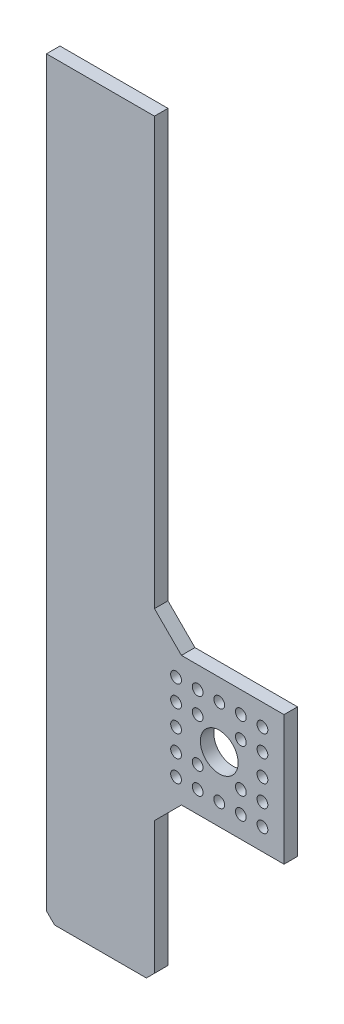
ISO-10303-21;
HEADER;
FILE_DESCRIPTION(('STEP AP214'),'2;1');
FILE_NAME('part.step','',(''),(''),'','','');
FILE_SCHEMA(('AUTOMOTIVE_DESIGN { 1 0 10303 214 1 1 1 1 }'));
ENDSEC;
DATA;
#1=APPLICATION_CONTEXT('core data for automotive mechanical design processes');
#2=APPLICATION_PROTOCOL_DEFINITION('international standard','automotive_design',2000,#1);
#3=PRODUCT_CONTEXT('',#1,'mechanical');
#4=PRODUCT('Part','Part','',(#3));
#5=PRODUCT_RELATED_PRODUCT_CATEGORY('part','',(#4));
#6=PRODUCT_DEFINITION_FORMATION('','',#4);
#7=PRODUCT_DEFINITION_CONTEXT('part definition',#1,'design');
#8=PRODUCT_DEFINITION('design','',#6,#7);
#9=PRODUCT_DEFINITION_SHAPE('','',#8);
#10=(LENGTH_UNIT() NAMED_UNIT(*) SI_UNIT(.MILLI.,.METRE.));
#11=(NAMED_UNIT(*) PLANE_ANGLE_UNIT() SI_UNIT($,.RADIAN.));
#12=(NAMED_UNIT(*) SI_UNIT($,.STERADIAN.) SOLID_ANGLE_UNIT());
#13=UNCERTAINTY_MEASURE_WITH_UNIT(LENGTH_MEASURE(1.E-05),#10,'distance_accuracy_value','');
#14=(GEOMETRIC_REPRESENTATION_CONTEXT(3) GLOBAL_UNCERTAINTY_ASSIGNED_CONTEXT((#13)) GLOBAL_UNIT_ASSIGNED_CONTEXT((#10,
#11,#12)) REPRESENTATION_CONTEXT('',''));
#15=CARTESIAN_POINT('',(0.,0.,0.));
#16=DIRECTION('',(0.,0.,1.));
#17=DIRECTION('',(1.,0.,0.));
#18=AXIS2_PLACEMENT_3D('',#15,#16,#17);
#19=CARTESIAN_POINT('',(0.,0.,5.));
#20=DIRECTION('',(0.,0.,1.));
#21=DIRECTION('',(1.,0.,0.));
#22=AXIS2_PLACEMENT_3D('',#19,#20,#21);
#23=PLANE('',#22);
#24=CARTESIAN_POINT('',(48.0000000000002,-200.,5.));
#25=DIRECTION('',(0.,0.,1.));
#26=DIRECTION('',(1.,0.,0.));
#27=AXIS2_PLACEMENT_3D('',#24,#25,#26);
#28=CIRCLE('',#27,2.);
#29=CARTESIAN_POINT('',(50.0000000000003,-200.,5.));
#30=VERTEX_POINT('',#29);
#31=EDGE_CURVE('E442',#30,#30,#28,.T.);
#32=ORIENTED_EDGE('',*,*,#31,.F.);
#33=EDGE_LOOP('',(#32));
#34=FACE_BOUND('',#33,.T.);
#35=CARTESIAN_POINT('',(48.0000000000001,-184.,5.));
#36=DIRECTION('',(0.,0.,1.));
#37=DIRECTION('',(1.,0.,0.));
#38=AXIS2_PLACEMENT_3D('',#35,#36,#37);
#39=CIRCLE('',#38,2.);
#40=CARTESIAN_POINT('',(50.0000000000001,-184.,5.));
#41=VERTEX_POINT('',#40);
#42=EDGE_CURVE('E426',#41,#41,#39,.T.);
#43=ORIENTED_EDGE('',*,*,#42,.F.);
#44=EDGE_LOOP('',(#43));
#45=FACE_BOUND('',#44,.T.);
#46=CARTESIAN_POINT('',(72.0000000000003,-208.,5.));
#47=DIRECTION('',(0.,0.,1.));
#48=DIRECTION('',(1.,0.,0.));
#49=AXIS2_PLACEMENT_3D('',#46,#47,#48);
#50=CIRCLE('',#49,2.00000000000001);
#51=CARTESIAN_POINT('',(74.0000000000003,-208.,5.));
#52=VERTEX_POINT('',#51);
#53=EDGE_CURVE('E410',#52,#52,#50,.T.);
#54=ORIENTED_EDGE('',*,*,#53,.F.);
#55=EDGE_LOOP('',(#54));
#56=FACE_BOUND('',#55,.T.);
#57=CARTESIAN_POINT('',(56.0000000000003,-208.,5.));
#58=DIRECTION('',(0.,0.,1.));
#59=DIRECTION('',(1.,0.,0.));
#60=AXIS2_PLACEMENT_3D('',#57,#58,#59);
#61=CIRCLE('',#60,2.);
#62=CARTESIAN_POINT('',(58.0000000000003,-208.,5.));
#63=VERTEX_POINT('',#62);
#64=EDGE_CURVE('E394',#63,#63,#61,.T.);
#65=ORIENTED_EDGE('',*,*,#64,.F.);
#66=EDGE_LOOP('',(#65));
#67=FACE_BOUND('',#66,.T.);
#68=CARTESIAN_POINT('',(72.0000000000002,-200.,5.));
#69=DIRECTION('',(0.,0.,1.));
#70=DIRECTION('',(1.,0.,0.));
#71=AXIS2_PLACEMENT_3D('',#68,#69,#70);
#72=CIRCLE('',#71,2.00000000000001);
#73=CARTESIAN_POINT('',(74.0000000000002,-200.,5.));
#74=VERTEX_POINT('',#73);
#75=EDGE_CURVE('E378',#74,#74,#72,.T.);
#76=ORIENTED_EDGE('',*,*,#75,.F.);
#77=EDGE_LOOP('',(#76));
#78=FACE_BOUND('',#77,.T.);
#79=CARTESIAN_POINT('',(80.0000000000001,-192.,5.));
#80=DIRECTION('',(0.,0.,1.));
#81=DIRECTION('',(1.,0.,0.));
#82=AXIS2_PLACEMENT_3D('',#79,#80,#81);
#83=CIRCLE('',#82,2.);
#84=CARTESIAN_POINT('',(82.0000000000001,-192.,5.));
#85=VERTEX_POINT('',#84);
#86=EDGE_CURVE('E362',#85,#85,#83,.T.);
#87=ORIENTED_EDGE('',*,*,#86,.F.);
#88=EDGE_LOOP('',(#87));
#89=FACE_BOUND('',#88,.T.);
#90=CARTESIAN_POINT('',(72.0000000000001,-184.,5.));
#91=DIRECTION('',(0.,0.,1.));
#92=DIRECTION('',(1.,0.,0.));
#93=AXIS2_PLACEMENT_3D('',#90,#91,#92);
#94=CIRCLE('',#93,2.00000000000001);
#95=CARTESIAN_POINT('',(74.0000000000001,-184.,5.));
#96=VERTEX_POINT('',#95);
#97=EDGE_CURVE('E346',#96,#96,#94,.T.);
#98=ORIENTED_EDGE('',*,*,#97,.F.);
#99=EDGE_LOOP('',(#98));
#100=FACE_BOUND('',#99,.T.);
#101=CARTESIAN_POINT('',(80.,-176.,5.));
#102=DIRECTION('',(0.,0.,1.));
#103=DIRECTION('',(1.,0.,0.));
#104=AXIS2_PLACEMENT_3D('',#101,#102,#103);
#105=CIRCLE('',#104,2.);
#106=CARTESIAN_POINT('',(82.,-176.,5.));
#107=VERTEX_POINT('',#106);
#108=EDGE_CURVE('E330',#107,#107,#105,.T.);
#109=ORIENTED_EDGE('',*,*,#108,.F.);
#110=EDGE_LOOP('',(#109));
#111=FACE_BOUND('',#110,.T.);
#112=CARTESIAN_POINT('',(64.,-176.,5.));
#113=DIRECTION('',(0.,0.,1.));
#114=DIRECTION('',(1.,0.,0.));
#115=AXIS2_PLACEMENT_3D('',#112,#113,#114);
#116=CIRCLE('',#115,2.00000000000001);
#117=CARTESIAN_POINT('',(66.,-176.,5.));
#118=VERTEX_POINT('',#117);
#119=EDGE_CURVE('E314',#118,#118,#116,.T.);
#120=ORIENTED_EDGE('',*,*,#119,.F.);
#121=EDGE_LOOP('',(#120));
#122=FACE_BOUND('',#121,.T.);
#123=CARTESIAN_POINT('',(48.,-176.,5.));
#124=DIRECTION('',(0.,0.,1.));
#125=DIRECTION('',(1.,0.,0.));
#126=AXIS2_PLACEMENT_3D('',#123,#124,#125);
#127=CIRCLE('',#126,2.);
#128=CARTESIAN_POINT('',(50.,-176.,5.));
#129=VERTEX_POINT('',#128);
#130=EDGE_CURVE('E298',#129,#129,#127,.T.);
#131=ORIENTED_EDGE('',*,*,#130,.F.);
#132=EDGE_LOOP('',(#131));
#133=FACE_BOUND('',#132,.T.);
#134=DIRECTION('',(0.,-1.,0.));
#135=VECTOR('',#134,1.);
#136=CARTESIAN_POINT('',(0.,0.,5.));
#137=LINE('',#136,#135);
#138=CARTESIAN_POINT('',(0.,0.,5.));
#139=VERTEX_POINT('',#138);
#140=CARTESIAN_POINT('',(0.,-275.,5.));
#141=VERTEX_POINT('',#140);
#142=EDGE_CURVE('E132',#139,#141,#137,.T.);
#143=ORIENTED_EDGE('',*,*,#142,.T.);
#144=DIRECTION('',(-0.707106781186541,0.707106781186554,0.));
#145=VECTOR('',#144,1.);
#146=CARTESIAN_POINT('',(-137.5,-137.499999999997,5.));
#147=LINE('',#146,#145);
#148=CARTESIAN_POINT('',(3.00000000000004,-278.,5.));
#149=VERTEX_POINT('',#148);
#150=EDGE_CURVE('E187',#141,#149,#147,.F.);
#151=ORIENTED_EDGE('',*,*,#150,.T.);
#152=DIRECTION('',(1.,0.,0.));
#153=VECTOR('',#152,1.);
#154=CARTESIAN_POINT('',(0.,-278.,5.));
#155=LINE('',#154,#153);
#156=CARTESIAN_POINT('',(37.,-278.,5.));
#157=VERTEX_POINT('',#156);
#158=EDGE_CURVE('E144',#149,#157,#155,.T.);
#159=ORIENTED_EDGE('',*,*,#158,.T.);
#160=DIRECTION('',(-0.707106781186548,-0.707106781186548,0.));
#161=VECTOR('',#160,1.);
#162=CARTESIAN_POINT('',(157.5,-157.5,5.));
#163=LINE('',#162,#161);
#164=CARTESIAN_POINT('',(40.,-275.,5.));
#165=VERTEX_POINT('',#164);
#166=EDGE_CURVE('E184',#157,#165,#163,.F.);
#167=ORIENTED_EDGE('',*,*,#166,.T.);
#168=DIRECTION('',(0.,1.,0.));
#169=VECTOR('',#168,1.);
#170=CARTESIAN_POINT('',(40.,-278.,5.));
#171=LINE('',#170,#169);
#172=CARTESIAN_POINT('',(40.,-226.,5.));
#173=VERTEX_POINT('',#172);
#174=EDGE_CURVE('E219',#165,#173,#171,.T.);
#175=ORIENTED_EDGE('',*,*,#174,.T.);
#176=DIRECTION('',(-0.70710678118655,-0.707106781186545,0.));
#177=VECTOR('',#176,1.);
#178=CARTESIAN_POINT('',(50.,-216.,5.));
#179=LINE('',#178,#177);
#180=CARTESIAN_POINT('',(50.,-216.,5.));
#181=VERTEX_POINT('',#180);
#182=EDGE_CURVE('E210',#173,#181,#179,.F.);
#183=ORIENTED_EDGE('',*,*,#182,.T.);
#184=DIRECTION('',(1.,0.,0.));
#185=VECTOR('',#184,1.);
#186=CARTESIAN_POINT('',(40.,-216.,5.));
#187=LINE('',#186,#185);
#188=CARTESIAN_POINT('',(88.,-216.,5.));
#189=VERTEX_POINT('',#188);
#190=EDGE_CURVE('E216',#181,#189,#187,.T.);
#191=ORIENTED_EDGE('',*,*,#190,.T.);
#192=DIRECTION('',(0.,1.,0.));
#193=VECTOR('',#192,1.);
#194=CARTESIAN_POINT('',(88.,-216.,5.));
#195=LINE('',#194,#193);
#196=CARTESIAN_POINT('',(88.,-168.,5.));
#197=VERTEX_POINT('',#196);
#198=EDGE_CURVE('E228',#189,#197,#195,.T.);
#199=ORIENTED_EDGE('',*,*,#198,.T.);
#200=DIRECTION('',(-1.,0.,0.));
#201=VECTOR('',#200,1.);
#202=CARTESIAN_POINT('',(88.,-168.,5.));
#203=LINE('',#202,#201);
#204=CARTESIAN_POINT('',(50.,-168.,5.));
#205=VERTEX_POINT('',#204);
#206=EDGE_CURVE('E267',#197,#205,#203,.T.);
#207=ORIENTED_EDGE('',*,*,#206,.T.);
#208=DIRECTION('',(0.707106781186545,-0.70710678118655,0.));
#209=VECTOR('',#208,1.);
#210=CARTESIAN_POINT('',(40.,-158.,5.));
#211=LINE('',#210,#209);
#212=CARTESIAN_POINT('',(40.,-158.,5.));
#213=VERTEX_POINT('',#212);
#214=EDGE_CURVE('E11',#205,#213,#211,.F.);
#215=ORIENTED_EDGE('',*,*,#214,.T.);
#216=DIRECTION('',(0.,1.,0.));
#217=VECTOR('',#216,1.);
#218=CARTESIAN_POINT('',(40.,-168.,5.));
#219=LINE('',#218,#217);
#220=CARTESIAN_POINT('',(40.,0.,5.));
#221=VERTEX_POINT('',#220);
#222=EDGE_CURVE('E150',#213,#221,#219,.T.);
#223=ORIENTED_EDGE('',*,*,#222,.T.);
#224=DIRECTION('',(-1.,0.,0.));
#225=VECTOR('',#224,1.);
#226=CARTESIAN_POINT('',(40.,0.,5.));
#227=LINE('',#226,#225);
#228=EDGE_CURVE('E145',#221,#139,#227,.T.);
#229=ORIENTED_EDGE('',*,*,#228,.T.);
#230=EDGE_LOOP('',(#143,#151,#159,#167,#175,#183,#191,#199,#207,#215,#223,#229));
#231=FACE_BOUND('',#230,.T.);
#232=CARTESIAN_POINT('',(64.,-192.,5.));
#233=DIRECTION('',(0.,0.,1.));
#234=DIRECTION('',(1.,0.,0.));
#235=AXIS2_PLACEMENT_3D('',#232,#233,#234);
#236=CIRCLE('',#235,7.);
#237=CARTESIAN_POINT('',(71.,-192.,5.));
#238=VERTEX_POINT('',#237);
#239=EDGE_CURVE('E279',#238,#238,#236,.T.);
#240=ORIENTED_EDGE('',*,*,#239,.F.);
#241=EDGE_LOOP('',(#240));
#242=FACE_BOUND('',#241,.T.);
#243=CARTESIAN_POINT('',(56.,-176.,5.));
#244=DIRECTION('',(0.,0.,1.));
#245=DIRECTION('',(1.,0.,0.));
#246=AXIS2_PLACEMENT_3D('',#243,#244,#245);
#247=CIRCLE('',#246,2.);
#248=CARTESIAN_POINT('',(58.,-176.,5.));
#249=VERTEX_POINT('',#248);
#250=EDGE_CURVE('E306',#249,#249,#247,.T.);
#251=ORIENTED_EDGE('',*,*,#250,.F.);
#252=EDGE_LOOP('',(#251));
#253=FACE_BOUND('',#252,.T.);
#254=CARTESIAN_POINT('',(72.,-176.,5.));
#255=DIRECTION('',(0.,0.,1.));
#256=DIRECTION('',(1.,0.,0.));
#257=AXIS2_PLACEMENT_3D('',#254,#255,#256);
#258=CIRCLE('',#257,2.00000000000001);
#259=CARTESIAN_POINT('',(74.,-176.,5.));
#260=VERTEX_POINT('',#259);
#261=EDGE_CURVE('E322',#260,#260,#258,.T.);
#262=ORIENTED_EDGE('',*,*,#261,.F.);
#263=EDGE_LOOP('',(#262));
#264=FACE_BOUND('',#263,.T.);
#265=CARTESIAN_POINT('',(56.0000000000001,-184.,5.));
#266=DIRECTION('',(0.,0.,1.));
#267=DIRECTION('',(1.,0.,0.));
#268=AXIS2_PLACEMENT_3D('',#265,#266,#267);
#269=CIRCLE('',#268,2.);
#270=CARTESIAN_POINT('',(58.0000000000001,-184.,5.));
#271=VERTEX_POINT('',#270);
#272=EDGE_CURVE('E338',#271,#271,#269,.T.);
#273=ORIENTED_EDGE('',*,*,#272,.F.);
#274=EDGE_LOOP('',(#273));
#275=FACE_BOUND('',#274,.T.);
#276=CARTESIAN_POINT('',(80.0000000000001,-184.,5.));
#277=DIRECTION('',(0.,0.,1.));
#278=DIRECTION('',(1.,0.,0.));
#279=AXIS2_PLACEMENT_3D('',#276,#277,#278);
#280=CIRCLE('',#279,2.);
#281=CARTESIAN_POINT('',(82.0000000000001,-184.,5.));
#282=VERTEX_POINT('',#281);
#283=EDGE_CURVE('E354',#282,#282,#280,.T.);
#284=ORIENTED_EDGE('',*,*,#283,.F.);
#285=EDGE_LOOP('',(#284));
#286=FACE_BOUND('',#285,.T.);
#287=CARTESIAN_POINT('',(56.0000000000002,-200.,5.));
#288=DIRECTION('',(0.,0.,1.));
#289=DIRECTION('',(1.,0.,0.));
#290=AXIS2_PLACEMENT_3D('',#287,#288,#289);
#291=CIRCLE('',#290,2.);
#292=CARTESIAN_POINT('',(58.0000000000002,-200.,5.));
#293=VERTEX_POINT('',#292);
#294=EDGE_CURVE('E370',#293,#293,#291,.T.);
#295=ORIENTED_EDGE('',*,*,#294,.F.);
#296=EDGE_LOOP('',(#295));
#297=FACE_BOUND('',#296,.T.);
#298=CARTESIAN_POINT('',(80.0000000000002,-200.,5.));
#299=DIRECTION('',(0.,0.,1.));
#300=DIRECTION('',(1.,0.,0.));
#301=AXIS2_PLACEMENT_3D('',#298,#299,#300);
#302=CIRCLE('',#301,2.);
#303=CARTESIAN_POINT('',(82.0000000000002,-200.,5.));
#304=VERTEX_POINT('',#303);
#305=EDGE_CURVE('E386',#304,#304,#302,.T.);
#306=ORIENTED_EDGE('',*,*,#305,.F.);
#307=EDGE_LOOP('',(#306));
#308=FACE_BOUND('',#307,.T.);
#309=CARTESIAN_POINT('',(64.0000000000003,-208.,5.));
#310=DIRECTION('',(0.,0.,1.));
#311=DIRECTION('',(1.,0.,0.));
#312=AXIS2_PLACEMENT_3D('',#309,#310,#311);
#313=CIRCLE('',#312,2.00000000000001);
#314=CARTESIAN_POINT('',(66.0000000000003,-208.,5.));
#315=VERTEX_POINT('',#314);
#316=EDGE_CURVE('E402',#315,#315,#313,.T.);
#317=ORIENTED_EDGE('',*,*,#316,.F.);
#318=EDGE_LOOP('',(#317));
#319=FACE_BOUND('',#318,.T.);
#320=CARTESIAN_POINT('',(80.0000000000003,-208.,5.));
#321=DIRECTION('',(0.,0.,1.));
#322=DIRECTION('',(1.,0.,0.));
#323=AXIS2_PLACEMENT_3D('',#320,#321,#322);
#324=CIRCLE('',#323,2.);
#325=CARTESIAN_POINT('',(82.0000000000003,-208.,5.));
#326=VERTEX_POINT('',#325);
#327=EDGE_CURVE('E418',#326,#326,#324,.T.);
#328=ORIENTED_EDGE('',*,*,#327,.F.);
#329=EDGE_LOOP('',(#328));
#330=FACE_BOUND('',#329,.T.);
#331=CARTESIAN_POINT('',(48.0000000000002,-192.,5.));
#332=DIRECTION('',(0.,0.,1.));
#333=DIRECTION('',(1.,0.,0.));
#334=AXIS2_PLACEMENT_3D('',#331,#332,#333);
#335=CIRCLE('',#334,2.);
#336=CARTESIAN_POINT('',(50.0000000000002,-192.,5.));
#337=VERTEX_POINT('',#336);
#338=EDGE_CURVE('E434',#337,#337,#335,.T.);
#339=ORIENTED_EDGE('',*,*,#338,.F.);
#340=EDGE_LOOP('',(#339));
#341=FACE_BOUND('',#340,.T.);
#342=CARTESIAN_POINT('',(48.0000000000003,-208.,5.));
#343=DIRECTION('',(0.,0.,1.));
#344=DIRECTION('',(1.,0.,0.));
#345=AXIS2_PLACEMENT_3D('',#342,#343,#344);
#346=CIRCLE('',#345,2.);
#347=CARTESIAN_POINT('',(50.0000000000003,-208.,5.));
#348=VERTEX_POINT('',#347);
#349=EDGE_CURVE('E450',#348,#348,#346,.T.);
#350=ORIENTED_EDGE('',*,*,#349,.F.);
#351=EDGE_LOOP('',(#350));
#352=FACE_BOUND('',#351,.T.);
#353=ADVANCED_FACE('F41',(#34,#45,#56,#67,#78,#89,#100,#111,#122,#133,#231,#242,#253,#264,#275,
#286,#297,#308,#319,#330,#341,#352),#23,.T.);
#354=CARTESIAN_POINT('',(0.,0.,0.));
#355=DIRECTION('',(0.,0.,1.));
#356=DIRECTION('',(1.,0.,0.));
#357=AXIS2_PLACEMENT_3D('',#354,#355,#356);
#358=PLANE('',#357);
#359=DIRECTION('',(1.,0.,0.));
#360=VECTOR('',#359,1.);
#361=CARTESIAN_POINT('',(0.,-278.,0.));
#362=LINE('',#361,#360);
#363=CARTESIAN_POINT('',(3.00000000000004,-278.,0.));
#364=VERTEX_POINT('',#363);
#365=CARTESIAN_POINT('',(37.,-278.,0.));
#366=VERTEX_POINT('',#365);
#367=EDGE_CURVE('E243',#364,#366,#362,.T.);
#368=ORIENTED_EDGE('',*,*,#367,.F.);
#369=DIRECTION('',(0.707106781186541,-0.707106781186554,0.));
#370=VECTOR('',#369,1.);
#371=CARTESIAN_POINT('',(3.00000000000004,-278.,0.));
#372=LINE('',#371,#370);
#373=CARTESIAN_POINT('',(0.,-275.,0.));
#374=VERTEX_POINT('',#373);
#375=EDGE_CURVE('E179',#364,#374,#372,.F.);
#376=ORIENTED_EDGE('',*,*,#375,.T.);
#377=DIRECTION('',(0.,-1.,0.));
#378=VECTOR('',#377,1.);
#379=CARTESIAN_POINT('',(0.,0.,0.));
#380=LINE('',#379,#378);
#381=CARTESIAN_POINT('',(0.,0.,0.));
#382=VERTEX_POINT('',#381);
#383=EDGE_CURVE('E250',#382,#374,#380,.T.);
#384=ORIENTED_EDGE('',*,*,#383,.F.);
#385=DIRECTION('',(-1.,0.,0.));
#386=VECTOR('',#385,1.);
#387=CARTESIAN_POINT('',(40.,0.,0.));
#388=LINE('',#387,#386);
#389=CARTESIAN_POINT('',(40.,0.,0.));
#390=VERTEX_POINT('',#389);
#391=EDGE_CURVE('E159',#390,#382,#388,.T.);
#392=ORIENTED_EDGE('',*,*,#391,.F.);
#393=DIRECTION('',(0.,1.,0.));
#394=VECTOR('',#393,1.);
#395=CARTESIAN_POINT('',(40.,-168.,0.));
#396=LINE('',#395,#394);
#397=CARTESIAN_POINT('',(40.,-158.,0.));
#398=VERTEX_POINT('',#397);
#399=EDGE_CURVE('E155',#398,#390,#396,.T.);
#400=ORIENTED_EDGE('',*,*,#399,.F.);
#401=DIRECTION('',(-0.707106781186545,0.70710678118655,0.));
#402=VECTOR('',#401,1.);
#403=CARTESIAN_POINT('',(-58.9999999999998,-58.9999999999993,0.));
#404=LINE('',#403,#402);
#405=CARTESIAN_POINT('',(50.,-168.,0.));
#406=VERTEX_POINT('',#405);
#407=EDGE_CURVE('E51',#398,#406,#404,.F.);
#408=ORIENTED_EDGE('',*,*,#407,.T.);
#409=DIRECTION('',(-1.,0.,0.));
#410=VECTOR('',#409,1.);
#411=CARTESIAN_POINT('',(88.,-168.,0.));
#412=LINE('',#411,#410);
#413=CARTESIAN_POINT('',(88.,-168.,0.));
#414=VERTEX_POINT('',#413);
#415=EDGE_CURVE('E256',#414,#406,#412,.T.);
#416=ORIENTED_EDGE('',*,*,#415,.F.);
#417=DIRECTION('',(0.,1.,0.));
#418=VECTOR('',#417,1.);
#419=CARTESIAN_POINT('',(88.,-216.,0.));
#420=LINE('',#419,#418);
#421=CARTESIAN_POINT('',(88.,-216.,0.));
#422=VERTEX_POINT('',#421);
#423=EDGE_CURVE('E247',#422,#414,#420,.T.);
#424=ORIENTED_EDGE('',*,*,#423,.F.);
#425=DIRECTION('',(1.,0.,0.));
#426=VECTOR('',#425,1.);
#427=CARTESIAN_POINT('',(40.,-216.,0.));
#428=LINE('',#427,#426);
#429=CARTESIAN_POINT('',(50.,-216.,0.));
#430=VERTEX_POINT('',#429);
#431=EDGE_CURVE('E238',#430,#422,#428,.T.);
#432=ORIENTED_EDGE('',*,*,#431,.F.);
#433=DIRECTION('',(0.70710678118655,0.707106781186545,0.));
#434=VECTOR('',#433,1.);
#435=CARTESIAN_POINT('',(133.,-133.000000000001,0.));
#436=LINE('',#435,#434);
#437=CARTESIAN_POINT('',(40.,-226.,0.));
#438=VERTEX_POINT('',#437);
#439=EDGE_CURVE('E207',#430,#438,#436,.F.);
#440=ORIENTED_EDGE('',*,*,#439,.T.);
#441=DIRECTION('',(0.,1.,0.));
#442=VECTOR('',#441,1.);
#443=CARTESIAN_POINT('',(40.,-278.,0.));
#444=LINE('',#443,#442);
#445=CARTESIAN_POINT('',(40.,-275.,0.));
#446=VERTEX_POINT('',#445);
#447=EDGE_CURVE('E236',#446,#438,#444,.T.);
#448=ORIENTED_EDGE('',*,*,#447,.F.);
#449=DIRECTION('',(0.707106781186548,0.707106781186548,0.));
#450=VECTOR('',#449,1.);
#451=CARTESIAN_POINT('',(40.,-275.,0.));
#452=LINE('',#451,#450);
#453=EDGE_CURVE('E176',#446,#366,#452,.F.);
#454=ORIENTED_EDGE('',*,*,#453,.T.);
#455=EDGE_LOOP('',(#368,#376,#384,#392,#400,#408,#416,#424,#432,#440,#448,#454));
#456=FACE_BOUND('',#455,.T.);
#457=CARTESIAN_POINT('',(64.,-192.,0.));
#458=DIRECTION('',(0.,0.,1.));
#459=DIRECTION('',(1.,0.,0.));
#460=AXIS2_PLACEMENT_3D('',#457,#458,#459);
#461=CIRCLE('',#460,7.);
#462=CARTESIAN_POINT('',(71.,-192.,0.));
#463=VERTEX_POINT('',#462);
#464=EDGE_CURVE('E294',#463,#463,#461,.T.);
#465=ORIENTED_EDGE('',*,*,#464,.T.);
#466=EDGE_LOOP('',(#465));
#467=FACE_BOUND('',#466,.T.);
#468=CARTESIAN_POINT('',(48.,-176.,0.));
#469=DIRECTION('',(0.,0.,1.));
#470=DIRECTION('',(1.,0.,0.));
#471=AXIS2_PLACEMENT_3D('',#468,#469,#470);
#472=CIRCLE('',#471,2.);
#473=CARTESIAN_POINT('',(50.,-176.,0.));
#474=VERTEX_POINT('',#473);
#475=EDGE_CURVE('E302',#474,#474,#472,.T.);
#476=ORIENTED_EDGE('',*,*,#475,.T.);
#477=EDGE_LOOP('',(#476));
#478=FACE_BOUND('',#477,.T.);
#479=CARTESIAN_POINT('',(56.,-176.,0.));
#480=DIRECTION('',(0.,0.,1.));
#481=DIRECTION('',(1.,0.,0.));
#482=AXIS2_PLACEMENT_3D('',#479,#480,#481);
#483=CIRCLE('',#482,2.);
#484=CARTESIAN_POINT('',(58.,-176.,0.));
#485=VERTEX_POINT('',#484);
#486=EDGE_CURVE('E310',#485,#485,#483,.T.);
#487=ORIENTED_EDGE('',*,*,#486,.T.);
#488=EDGE_LOOP('',(#487));
#489=FACE_BOUND('',#488,.T.);
#490=CARTESIAN_POINT('',(64.,-176.,0.));
#491=DIRECTION('',(0.,0.,1.));
#492=DIRECTION('',(1.,0.,0.));
#493=AXIS2_PLACEMENT_3D('',#490,#491,#492);
#494=CIRCLE('',#493,2.00000000000001);
#495=CARTESIAN_POINT('',(66.,-176.,0.));
#496=VERTEX_POINT('',#495);
#497=EDGE_CURVE('E318',#496,#496,#494,.T.);
#498=ORIENTED_EDGE('',*,*,#497,.T.);
#499=EDGE_LOOP('',(#498));
#500=FACE_BOUND('',#499,.T.);
#501=CARTESIAN_POINT('',(72.,-176.,0.));
#502=DIRECTION('',(0.,0.,1.));
#503=DIRECTION('',(1.,0.,0.));
#504=AXIS2_PLACEMENT_3D('',#501,#502,#503);
#505=CIRCLE('',#504,2.00000000000001);
#506=CARTESIAN_POINT('',(74.,-176.,0.));
#507=VERTEX_POINT('',#506);
#508=EDGE_CURVE('E326',#507,#507,#505,.T.);
#509=ORIENTED_EDGE('',*,*,#508,.T.);
#510=EDGE_LOOP('',(#509));
#511=FACE_BOUND('',#510,.T.);
#512=CARTESIAN_POINT('',(80.,-176.,0.));
#513=DIRECTION('',(0.,0.,1.));
#514=DIRECTION('',(1.,0.,0.));
#515=AXIS2_PLACEMENT_3D('',#512,#513,#514);
#516=CIRCLE('',#515,2.);
#517=CARTESIAN_POINT('',(82.,-176.,0.));
#518=VERTEX_POINT('',#517);
#519=EDGE_CURVE('E334',#518,#518,#516,.T.);
#520=ORIENTED_EDGE('',*,*,#519,.T.);
#521=EDGE_LOOP('',(#520));
#522=FACE_BOUND('',#521,.T.);
#523=CARTESIAN_POINT('',(56.0000000000001,-184.,0.));
#524=DIRECTION('',(0.,0.,1.));
#525=DIRECTION('',(1.,0.,0.));
#526=AXIS2_PLACEMENT_3D('',#523,#524,#525);
#527=CIRCLE('',#526,2.);
#528=CARTESIAN_POINT('',(58.0000000000001,-184.,0.));
#529=VERTEX_POINT('',#528);
#530=EDGE_CURVE('E342',#529,#529,#527,.T.);
#531=ORIENTED_EDGE('',*,*,#530,.T.);
#532=EDGE_LOOP('',(#531));
#533=FACE_BOUND('',#532,.T.);
#534=CARTESIAN_POINT('',(72.0000000000001,-184.,0.));
#535=DIRECTION('',(0.,0.,1.));
#536=DIRECTION('',(1.,0.,0.));
#537=AXIS2_PLACEMENT_3D('',#534,#535,#536);
#538=CIRCLE('',#537,2.00000000000001);
#539=CARTESIAN_POINT('',(74.0000000000001,-184.,0.));
#540=VERTEX_POINT('',#539);
#541=EDGE_CURVE('E350',#540,#540,#538,.T.);
#542=ORIENTED_EDGE('',*,*,#541,.T.);
#543=EDGE_LOOP('',(#542));
#544=FACE_BOUND('',#543,.T.);
#545=CARTESIAN_POINT('',(80.0000000000001,-184.,0.));
#546=DIRECTION('',(0.,0.,1.));
#547=DIRECTION('',(1.,0.,0.));
#548=AXIS2_PLACEMENT_3D('',#545,#546,#547);
#549=CIRCLE('',#548,2.);
#550=CARTESIAN_POINT('',(82.0000000000001,-184.,0.));
#551=VERTEX_POINT('',#550);
#552=EDGE_CURVE('E358',#551,#551,#549,.T.);
#553=ORIENTED_EDGE('',*,*,#552,.T.);
#554=EDGE_LOOP('',(#553));
#555=FACE_BOUND('',#554,.T.);
#556=CARTESIAN_POINT('',(80.0000000000001,-192.,0.));
#557=DIRECTION('',(0.,0.,1.));
#558=DIRECTION('',(1.,0.,0.));
#559=AXIS2_PLACEMENT_3D('',#556,#557,#558);
#560=CIRCLE('',#559,2.);
#561=CARTESIAN_POINT('',(82.0000000000001,-192.,0.));
#562=VERTEX_POINT('',#561);
#563=EDGE_CURVE('E366',#562,#562,#560,.T.);
#564=ORIENTED_EDGE('',*,*,#563,.T.);
#565=EDGE_LOOP('',(#564));
#566=FACE_BOUND('',#565,.T.);
#567=CARTESIAN_POINT('',(56.0000000000002,-200.,0.));
#568=DIRECTION('',(0.,0.,1.));
#569=DIRECTION('',(1.,0.,0.));
#570=AXIS2_PLACEMENT_3D('',#567,#568,#569);
#571=CIRCLE('',#570,2.);
#572=CARTESIAN_POINT('',(58.0000000000002,-200.,0.));
#573=VERTEX_POINT('',#572);
#574=EDGE_CURVE('E374',#573,#573,#571,.T.);
#575=ORIENTED_EDGE('',*,*,#574,.T.);
#576=EDGE_LOOP('',(#575));
#577=FACE_BOUND('',#576,.T.);
#578=CARTESIAN_POINT('',(72.0000000000002,-200.,0.));
#579=DIRECTION('',(0.,0.,1.));
#580=DIRECTION('',(1.,0.,0.));
#581=AXIS2_PLACEMENT_3D('',#578,#579,#580);
#582=CIRCLE('',#581,2.00000000000001);
#583=CARTESIAN_POINT('',(74.0000000000002,-200.,0.));
#584=VERTEX_POINT('',#583);
#585=EDGE_CURVE('E382',#584,#584,#582,.T.);
#586=ORIENTED_EDGE('',*,*,#585,.T.);
#587=EDGE_LOOP('',(#586));
#588=FACE_BOUND('',#587,.T.);
#589=CARTESIAN_POINT('',(80.0000000000002,-200.,0.));
#590=DIRECTION('',(0.,0.,1.));
#591=DIRECTION('',(1.,0.,0.));
#592=AXIS2_PLACEMENT_3D('',#589,#590,#591);
#593=CIRCLE('',#592,2.);
#594=CARTESIAN_POINT('',(82.0000000000002,-200.,0.));
#595=VERTEX_POINT('',#594);
#596=EDGE_CURVE('E390',#595,#595,#593,.T.);
#597=ORIENTED_EDGE('',*,*,#596,.T.);
#598=EDGE_LOOP('',(#597));
#599=FACE_BOUND('',#598,.T.);
#600=CARTESIAN_POINT('',(56.0000000000003,-208.,0.));
#601=DIRECTION('',(0.,0.,1.));
#602=DIRECTION('',(1.,0.,0.));
#603=AXIS2_PLACEMENT_3D('',#600,#601,#602);
#604=CIRCLE('',#603,2.);
#605=CARTESIAN_POINT('',(58.0000000000003,-208.,0.));
#606=VERTEX_POINT('',#605);
#607=EDGE_CURVE('E398',#606,#606,#604,.T.);
#608=ORIENTED_EDGE('',*,*,#607,.T.);
#609=EDGE_LOOP('',(#608));
#610=FACE_BOUND('',#609,.T.);
#611=CARTESIAN_POINT('',(64.0000000000003,-208.,0.));
#612=DIRECTION('',(0.,0.,1.));
#613=DIRECTION('',(1.,0.,0.));
#614=AXIS2_PLACEMENT_3D('',#611,#612,#613);
#615=CIRCLE('',#614,2.00000000000001);
#616=CARTESIAN_POINT('',(66.0000000000003,-208.,0.));
#617=VERTEX_POINT('',#616);
#618=EDGE_CURVE('E406',#617,#617,#615,.T.);
#619=ORIENTED_EDGE('',*,*,#618,.T.);
#620=EDGE_LOOP('',(#619));
#621=FACE_BOUND('',#620,.T.);
#622=CARTESIAN_POINT('',(72.0000000000003,-208.,0.));
#623=DIRECTION('',(0.,0.,1.));
#624=DIRECTION('',(1.,0.,0.));
#625=AXIS2_PLACEMENT_3D('',#622,#623,#624);
#626=CIRCLE('',#625,2.00000000000001);
#627=CARTESIAN_POINT('',(74.0000000000003,-208.,0.));
#628=VERTEX_POINT('',#627);
#629=EDGE_CURVE('E414',#628,#628,#626,.T.);
#630=ORIENTED_EDGE('',*,*,#629,.T.);
#631=EDGE_LOOP('',(#630));
#632=FACE_BOUND('',#631,.T.);
#633=CARTESIAN_POINT('',(80.0000000000003,-208.,0.));
#634=DIRECTION('',(0.,0.,1.));
#635=DIRECTION('',(1.,0.,0.));
#636=AXIS2_PLACEMENT_3D('',#633,#634,#635);
#637=CIRCLE('',#636,2.);
#638=CARTESIAN_POINT('',(82.0000000000003,-208.,0.));
#639=VERTEX_POINT('',#638);
#640=EDGE_CURVE('E422',#639,#639,#637,.T.);
#641=ORIENTED_EDGE('',*,*,#640,.T.);
#642=EDGE_LOOP('',(#641));
#643=FACE_BOUND('',#642,.T.);
#644=CARTESIAN_POINT('',(48.0000000000001,-184.,0.));
#645=DIRECTION('',(0.,0.,1.));
#646=DIRECTION('',(1.,0.,0.));
#647=AXIS2_PLACEMENT_3D('',#644,#645,#646);
#648=CIRCLE('',#647,2.);
#649=CARTESIAN_POINT('',(50.0000000000001,-184.,0.));
#650=VERTEX_POINT('',#649);
#651=EDGE_CURVE('E430',#650,#650,#648,.T.);
#652=ORIENTED_EDGE('',*,*,#651,.T.);
#653=EDGE_LOOP('',(#652));
#654=FACE_BOUND('',#653,.T.);
#655=CARTESIAN_POINT('',(48.0000000000002,-192.,0.));
#656=DIRECTION('',(0.,0.,1.));
#657=DIRECTION('',(1.,0.,0.));
#658=AXIS2_PLACEMENT_3D('',#655,#656,#657);
#659=CIRCLE('',#658,2.);
#660=CARTESIAN_POINT('',(50.0000000000002,-192.,0.));
#661=VERTEX_POINT('',#660);
#662=EDGE_CURVE('E438',#661,#661,#659,.T.);
#663=ORIENTED_EDGE('',*,*,#662,.T.);
#664=EDGE_LOOP('',(#663));
#665=FACE_BOUND('',#664,.T.);
#666=CARTESIAN_POINT('',(48.0000000000002,-200.,0.));
#667=DIRECTION('',(0.,0.,1.));
#668=DIRECTION('',(1.,0.,0.));
#669=AXIS2_PLACEMENT_3D('',#666,#667,#668);
#670=CIRCLE('',#669,2.);
#671=CARTESIAN_POINT('',(50.0000000000003,-200.,0.));
#672=VERTEX_POINT('',#671);
#673=EDGE_CURVE('E446',#672,#672,#670,.T.);
#674=ORIENTED_EDGE('',*,*,#673,.T.);
#675=EDGE_LOOP('',(#674));
#676=FACE_BOUND('',#675,.T.);
#677=CARTESIAN_POINT('',(48.0000000000003,-208.,0.));
#678=DIRECTION('',(0.,0.,1.));
#679=DIRECTION('',(1.,0.,0.));
#680=AXIS2_PLACEMENT_3D('',#677,#678,#679);
#681=CIRCLE('',#680,2.);
#682=CARTESIAN_POINT('',(50.0000000000003,-208.,0.));
#683=VERTEX_POINT('',#682);
#684=EDGE_CURVE('E454',#683,#683,#681,.T.);
#685=ORIENTED_EDGE('',*,*,#684,.T.);
#686=EDGE_LOOP('',(#685));
#687=FACE_BOUND('',#686,.T.);
#688=ADVANCED_FACE('F234',(#456,#467,#478,#489,#500,#511,#522,#533,#544,#555,#566,#577,#588,
#599,#610,#621,#632,#643,#654,#665,#676,#687),#358,.F.);
#689=CARTESIAN_POINT('',(40.,0.,5.));
#690=DIRECTION('',(0.,-1.,0.));
#691=DIRECTION('',(1.,0.,0.));
#692=AXIS2_PLACEMENT_3D('',#689,#690,#691);
#693=PLANE('',#692);
#694=ORIENTED_EDGE('',*,*,#391,.T.);
#695=DIRECTION('',(0.,0.,-1.));
#696=VECTOR('',#695,1.);
#697=CARTESIAN_POINT('',(0.,0.,5.));
#698=LINE('',#697,#696);
#699=EDGE_CURVE('E137',#139,#382,#698,.T.);
#700=ORIENTED_EDGE('',*,*,#699,.F.);
#701=ORIENTED_EDGE('',*,*,#228,.F.);
#702=DIRECTION('',(0.,0.,-1.));
#703=VECTOR('',#702,1.);
#704=CARTESIAN_POINT('',(40.,0.,5.));
#705=LINE('',#704,#703);
#706=EDGE_CURVE('E261',#221,#390,#705,.T.);
#707=ORIENTED_EDGE('',*,*,#706,.T.);
#708=EDGE_LOOP('',(#694,#700,#701,#707));
#709=FACE_BOUND('',#708,.T.);
#710=ADVANCED_FACE('F157',(#709),#693,.F.);
#711=CARTESIAN_POINT('',(0.,0.,5.));
#712=DIRECTION('',(1.,0.,0.));
#713=DIRECTION('',(0.,1.,0.));
#714=AXIS2_PLACEMENT_3D('',#711,#712,#713);
#715=PLANE('',#714);
#716=ORIENTED_EDGE('',*,*,#383,.T.);
#717=DIRECTION('',(0.,0.,1.));
#718=VECTOR('',#717,1.);
#719=CARTESIAN_POINT('',(0.,-275.,5.));
#720=LINE('',#719,#718);
#721=EDGE_CURVE('E140',#374,#141,#720,.T.);
#722=ORIENTED_EDGE('',*,*,#721,.T.);
#723=ORIENTED_EDGE('',*,*,#142,.F.);
#724=ORIENTED_EDGE('',*,*,#699,.T.);
#725=EDGE_LOOP('',(#716,#722,#723,#724));
#726=FACE_BOUND('',#725,.T.);
#727=ADVANCED_FACE('F135',(#726),#715,.F.);
#728=CARTESIAN_POINT('',(0.,-278.,5.));
#729=DIRECTION('',(0.,1.,0.));
#730=DIRECTION('',(0.,0.,1.));
#731=AXIS2_PLACEMENT_3D('',#728,#729,#730);
#732=PLANE('',#731);
#733=ORIENTED_EDGE('',*,*,#158,.F.);
#734=DIRECTION('',(0.,0.,-1.));
#735=VECTOR('',#734,1.);
#736=CARTESIAN_POINT('',(3.00000000000004,-278.,5.));
#737=LINE('',#736,#735);
#738=EDGE_CURVE('E166',#149,#364,#737,.T.);
#739=ORIENTED_EDGE('',*,*,#738,.T.);
#740=ORIENTED_EDGE('',*,*,#367,.T.);
#741=DIRECTION('',(0.,0.,1.));
#742=VECTOR('',#741,1.);
#743=CARTESIAN_POINT('',(37.,-278.,5.));
#744=LINE('',#743,#742);
#745=EDGE_CURVE('E161',#366,#157,#744,.T.);
#746=ORIENTED_EDGE('',*,*,#745,.T.);
#747=EDGE_LOOP('',(#733,#739,#740,#746));
#748=FACE_BOUND('',#747,.T.);
#749=ADVANCED_FACE('F288',(#748),#732,.F.);
#750=CARTESIAN_POINT('',(40.,-278.,5.));
#751=DIRECTION('',(-1.,0.,0.));
#752=DIRECTION('',(0.,0.,1.));
#753=AXIS2_PLACEMENT_3D('',#750,#751,#752);
#754=PLANE('',#753);
#755=ORIENTED_EDGE('',*,*,#447,.T.);
#756=DIRECTION('',(0.,0.,1.));
#757=VECTOR('',#756,1.);
#758=CARTESIAN_POINT('',(40.,-226.,5.));
#759=LINE('',#758,#757);
#760=EDGE_CURVE('E198',#438,#173,#759,.T.);
#761=ORIENTED_EDGE('',*,*,#760,.T.);
#762=ORIENTED_EDGE('',*,*,#174,.F.);
#763=DIRECTION('',(0.,0.,-1.));
#764=VECTOR('',#763,1.);
#765=CARTESIAN_POINT('',(40.,-275.,5.));
#766=LINE('',#765,#764);
#767=EDGE_CURVE('E190',#165,#446,#766,.T.);
#768=ORIENTED_EDGE('',*,*,#767,.T.);
#769=EDGE_LOOP('',(#755,#761,#762,#768));
#770=FACE_BOUND('',#769,.T.);
#771=ADVANCED_FACE('F240',(#770),#754,.F.);
#772=CARTESIAN_POINT('',(40.,-216.,5.));
#773=DIRECTION('',(0.,1.,0.));
#774=DIRECTION('',(-1.,0.,0.));
#775=AXIS2_PLACEMENT_3D('',#772,#773,#774);
#776=PLANE('',#775);
#777=ORIENTED_EDGE('',*,*,#190,.F.);
#778=DIRECTION('',(0.,0.,-1.));
#779=VECTOR('',#778,1.);
#780=CARTESIAN_POINT('',(50.,-216.,0.));
#781=LINE('',#780,#779);
#782=EDGE_CURVE('E194',#181,#430,#781,.T.);
#783=ORIENTED_EDGE('',*,*,#782,.T.);
#784=ORIENTED_EDGE('',*,*,#431,.T.);
#785=DIRECTION('',(0.,0.,-1.));
#786=VECTOR('',#785,1.);
#787=CARTESIAN_POINT('',(88.,-216.,5.));
#788=LINE('',#787,#786);
#789=EDGE_CURVE('E162',#189,#422,#788,.T.);
#790=ORIENTED_EDGE('',*,*,#789,.F.);
#791=EDGE_LOOP('',(#777,#783,#784,#790));
#792=FACE_BOUND('',#791,.T.);
#793=ADVANCED_FACE('F224',(#792),#776,.F.);
#794=CARTESIAN_POINT('',(88.,-216.,5.));
#795=DIRECTION('',(-1.,0.,0.));
#796=DIRECTION('',(0.,-1.,0.));
#797=AXIS2_PLACEMENT_3D('',#794,#795,#796);
#798=PLANE('',#797);
#799=ORIENTED_EDGE('',*,*,#423,.T.);
#800=DIRECTION('',(0.,0.,-1.));
#801=VECTOR('',#800,1.);
#802=CARTESIAN_POINT('',(88.,-168.,5.));
#803=LINE('',#802,#801);
#804=EDGE_CURVE('E169',#197,#414,#803,.T.);
#805=ORIENTED_EDGE('',*,*,#804,.F.);
#806=ORIENTED_EDGE('',*,*,#198,.F.);
#807=ORIENTED_EDGE('',*,*,#789,.T.);
#808=EDGE_LOOP('',(#799,#805,#806,#807));
#809=FACE_BOUND('',#808,.T.);
#810=ADVANCED_FACE('F269',(#809),#798,.F.);
#811=CARTESIAN_POINT('',(88.,-168.,5.));
#812=DIRECTION('',(0.,-1.,0.));
#813=DIRECTION('',(0.,0.,-1.));
#814=AXIS2_PLACEMENT_3D('',#811,#812,#813);
#815=PLANE('',#814);
#816=ORIENTED_EDGE('',*,*,#415,.T.);
#817=DIRECTION('',(0.,0.,1.));
#818=VECTOR('',#817,1.);
#819=CARTESIAN_POINT('',(50.,-168.,5.));
#820=LINE('',#819,#818);
#821=EDGE_CURVE('E58',#406,#205,#820,.T.);
#822=ORIENTED_EDGE('',*,*,#821,.T.);
#823=ORIENTED_EDGE('',*,*,#206,.F.);
#824=ORIENTED_EDGE('',*,*,#804,.T.);
#825=EDGE_LOOP('',(#816,#822,#823,#824));
#826=FACE_BOUND('',#825,.T.);
#827=ADVANCED_FACE('F266',(#826),#815,.F.);
#828=CARTESIAN_POINT('',(40.,-168.,5.));
#829=DIRECTION('',(-1.,0.,0.));
#830=DIRECTION('',(0.,0.,1.));
#831=AXIS2_PLACEMENT_3D('',#828,#829,#830);
#832=PLANE('',#831);
#833=ORIENTED_EDGE('',*,*,#222,.F.);
#834=DIRECTION('',(0.,0.,-1.));
#835=VECTOR('',#834,1.);
#836=CARTESIAN_POINT('',(40.,-158.,0.));
#837=LINE('',#836,#835);
#838=EDGE_CURVE('E201',#213,#398,#837,.T.);
#839=ORIENTED_EDGE('',*,*,#838,.T.);
#840=ORIENTED_EDGE('',*,*,#399,.T.);
#841=ORIENTED_EDGE('',*,*,#706,.F.);
#842=EDGE_LOOP('',(#833,#839,#840,#841));
#843=FACE_BOUND('',#842,.T.);
#844=ADVANCED_FACE('F478',(#843),#832,.F.);
#845=CARTESIAN_POINT('',(64.,-192.,5.));
#846=DIRECTION('',(0.,0.,-1.));
#847=DIRECTION('',(-1.,0.,0.));
#848=AXIS2_PLACEMENT_3D('',#845,#846,#847);
#849=CYLINDRICAL_SURFACE('',#848,7.);
#850=ORIENTED_EDGE('',*,*,#239,.T.);
#851=EDGE_LOOP('',(#850));
#852=FACE_BOUND('',#851,.T.);
#853=ORIENTED_EDGE('',*,*,#464,.F.);
#854=EDGE_LOOP('',(#853));
#855=FACE_BOUND('',#854,.T.);
#856=ADVANCED_FACE('F475',(#852,#855),#849,.F.);
#857=CARTESIAN_POINT('',(48.,-176.,5.));
#858=DIRECTION('',(0.,0.,-1.));
#859=DIRECTION('',(-1.,0.,0.));
#860=AXIS2_PLACEMENT_3D('',#857,#858,#859);
#861=CYLINDRICAL_SURFACE('',#860,2.);
#862=ORIENTED_EDGE('',*,*,#130,.T.);
#863=EDGE_LOOP('',(#862));
#864=FACE_BOUND('',#863,.T.);
#865=ORIENTED_EDGE('',*,*,#475,.F.);
#866=EDGE_LOOP('',(#865));
#867=FACE_BOUND('',#866,.T.);
#868=ADVANCED_FACE('F773',(#864,#867),#861,.F.);
#869=CARTESIAN_POINT('',(56.,-176.,5.));
#870=DIRECTION('',(0.,0.,-1.));
#871=DIRECTION('',(-1.,0.,0.));
#872=AXIS2_PLACEMENT_3D('',#869,#870,#871);
#873=CYLINDRICAL_SURFACE('',#872,2.);
#874=ORIENTED_EDGE('',*,*,#250,.T.);
#875=EDGE_LOOP('',(#874));
#876=FACE_BOUND('',#875,.T.);
#877=ORIENTED_EDGE('',*,*,#486,.F.);
#878=EDGE_LOOP('',(#877));
#879=FACE_BOUND('',#878,.T.);
#880=ADVANCED_FACE('F763',(#876,#879),#873,.F.);
#881=CARTESIAN_POINT('',(64.,-176.,5.));
#882=DIRECTION('',(0.,0.,-1.));
#883=DIRECTION('',(-1.,0.,0.));
#884=AXIS2_PLACEMENT_3D('',#881,#882,#883);
#885=CYLINDRICAL_SURFACE('',#884,2.00000000000001);
#886=ORIENTED_EDGE('',*,*,#119,.T.);
#887=EDGE_LOOP('',(#886));
#888=FACE_BOUND('',#887,.T.);
#889=ORIENTED_EDGE('',*,*,#497,.F.);
#890=EDGE_LOOP('',(#889));
#891=FACE_BOUND('',#890,.T.);
#892=ADVANCED_FACE('F753',(#888,#891),#885,.F.);
#893=CARTESIAN_POINT('',(72.,-176.,5.));
#894=DIRECTION('',(0.,0.,-1.));
#895=DIRECTION('',(-1.,0.,0.));
#896=AXIS2_PLACEMENT_3D('',#893,#894,#895);
#897=CYLINDRICAL_SURFACE('',#896,2.00000000000001);
#898=ORIENTED_EDGE('',*,*,#261,.T.);
#899=EDGE_LOOP('',(#898));
#900=FACE_BOUND('',#899,.T.);
#901=ORIENTED_EDGE('',*,*,#508,.F.);
#902=EDGE_LOOP('',(#901));
#903=FACE_BOUND('',#902,.T.);
#904=ADVANCED_FACE('F743',(#900,#903),#897,.F.);
#905=CARTESIAN_POINT('',(80.,-176.,5.));
#906=DIRECTION('',(0.,0.,-1.));
#907=DIRECTION('',(-1.,0.,0.));
#908=AXIS2_PLACEMENT_3D('',#905,#906,#907);
#909=CYLINDRICAL_SURFACE('',#908,2.);
#910=ORIENTED_EDGE('',*,*,#108,.T.);
#911=EDGE_LOOP('',(#910));
#912=FACE_BOUND('',#911,.T.);
#913=ORIENTED_EDGE('',*,*,#519,.F.);
#914=EDGE_LOOP('',(#913));
#915=FACE_BOUND('',#914,.T.);
#916=ADVANCED_FACE('F733',(#912,#915),#909,.F.);
#917=CARTESIAN_POINT('',(56.0000000000001,-184.,5.));
#918=DIRECTION('',(0.,0.,-1.));
#919=DIRECTION('',(-1.,0.,0.));
#920=AXIS2_PLACEMENT_3D('',#917,#918,#919);
#921=CYLINDRICAL_SURFACE('',#920,2.);
#922=ORIENTED_EDGE('',*,*,#272,.T.);
#923=EDGE_LOOP('',(#922));
#924=FACE_BOUND('',#923,.T.);
#925=ORIENTED_EDGE('',*,*,#530,.F.);
#926=EDGE_LOOP('',(#925));
#927=FACE_BOUND('',#926,.T.);
#928=ADVANCED_FACE('F723',(#924,#927),#921,.F.);
#929=CARTESIAN_POINT('',(72.0000000000001,-184.,5.));
#930=DIRECTION('',(0.,0.,-1.));
#931=DIRECTION('',(-1.,0.,0.));
#932=AXIS2_PLACEMENT_3D('',#929,#930,#931);
#933=CYLINDRICAL_SURFACE('',#932,2.00000000000001);
#934=ORIENTED_EDGE('',*,*,#97,.T.);
#935=EDGE_LOOP('',(#934));
#936=FACE_BOUND('',#935,.T.);
#937=ORIENTED_EDGE('',*,*,#541,.F.);
#938=EDGE_LOOP('',(#937));
#939=FACE_BOUND('',#938,.T.);
#940=ADVANCED_FACE('F713',(#936,#939),#933,.F.);
#941=CARTESIAN_POINT('',(80.0000000000001,-184.,5.));
#942=DIRECTION('',(0.,0.,-1.));
#943=DIRECTION('',(-1.,0.,0.));
#944=AXIS2_PLACEMENT_3D('',#941,#942,#943);
#945=CYLINDRICAL_SURFACE('',#944,2.);
#946=ORIENTED_EDGE('',*,*,#283,.T.);
#947=EDGE_LOOP('',(#946));
#948=FACE_BOUND('',#947,.T.);
#949=ORIENTED_EDGE('',*,*,#552,.F.);
#950=EDGE_LOOP('',(#949));
#951=FACE_BOUND('',#950,.T.);
#952=ADVANCED_FACE('F703',(#948,#951),#945,.F.);
#953=CARTESIAN_POINT('',(80.0000000000001,-192.,5.));
#954=DIRECTION('',(0.,0.,-1.));
#955=DIRECTION('',(-1.,0.,0.));
#956=AXIS2_PLACEMENT_3D('',#953,#954,#955);
#957=CYLINDRICAL_SURFACE('',#956,2.);
#958=ORIENTED_EDGE('',*,*,#86,.T.);
#959=EDGE_LOOP('',(#958));
#960=FACE_BOUND('',#959,.T.);
#961=ORIENTED_EDGE('',*,*,#563,.F.);
#962=EDGE_LOOP('',(#961));
#963=FACE_BOUND('',#962,.T.);
#964=ADVANCED_FACE('F693',(#960,#963),#957,.F.);
#965=CARTESIAN_POINT('',(56.0000000000002,-200.,5.));
#966=DIRECTION('',(0.,0.,-1.));
#967=DIRECTION('',(-1.,0.,0.));
#968=AXIS2_PLACEMENT_3D('',#965,#966,#967);
#969=CYLINDRICAL_SURFACE('',#968,2.);
#970=ORIENTED_EDGE('',*,*,#294,.T.);
#971=EDGE_LOOP('',(#970));
#972=FACE_BOUND('',#971,.T.);
#973=ORIENTED_EDGE('',*,*,#574,.F.);
#974=EDGE_LOOP('',(#973));
#975=FACE_BOUND('',#974,.T.);
#976=ADVANCED_FACE('F683',(#972,#975),#969,.F.);
#977=CARTESIAN_POINT('',(72.0000000000002,-200.,5.));
#978=DIRECTION('',(0.,0.,-1.));
#979=DIRECTION('',(-1.,0.,0.));
#980=AXIS2_PLACEMENT_3D('',#977,#978,#979);
#981=CYLINDRICAL_SURFACE('',#980,2.00000000000001);
#982=ORIENTED_EDGE('',*,*,#75,.T.);
#983=EDGE_LOOP('',(#982));
#984=FACE_BOUND('',#983,.T.);
#985=ORIENTED_EDGE('',*,*,#585,.F.);
#986=EDGE_LOOP('',(#985));
#987=FACE_BOUND('',#986,.T.);
#988=ADVANCED_FACE('F673',(#984,#987),#981,.F.);
#989=CARTESIAN_POINT('',(80.0000000000002,-200.,5.));
#990=DIRECTION('',(0.,0.,-1.));
#991=DIRECTION('',(-1.,0.,0.));
#992=AXIS2_PLACEMENT_3D('',#989,#990,#991);
#993=CYLINDRICAL_SURFACE('',#992,2.);
#994=ORIENTED_EDGE('',*,*,#305,.T.);
#995=EDGE_LOOP('',(#994));
#996=FACE_BOUND('',#995,.T.);
#997=ORIENTED_EDGE('',*,*,#596,.F.);
#998=EDGE_LOOP('',(#997));
#999=FACE_BOUND('',#998,.T.);
#1000=ADVANCED_FACE('F663',(#996,#999),#993,.F.);
#1001=CARTESIAN_POINT('',(56.0000000000003,-208.,5.));
#1002=DIRECTION('',(0.,0.,-1.));
#1003=DIRECTION('',(-1.,0.,0.));
#1004=AXIS2_PLACEMENT_3D('',#1001,#1002,#1003);
#1005=CYLINDRICAL_SURFACE('',#1004,2.);
#1006=ORIENTED_EDGE('',*,*,#64,.T.);
#1007=EDGE_LOOP('',(#1006));
#1008=FACE_BOUND('',#1007,.T.);
#1009=ORIENTED_EDGE('',*,*,#607,.F.);
#1010=EDGE_LOOP('',(#1009));
#1011=FACE_BOUND('',#1010,.T.);
#1012=ADVANCED_FACE('F653',(#1008,#1011),#1005,.F.);
#1013=CARTESIAN_POINT('',(64.0000000000003,-208.,5.));
#1014=DIRECTION('',(0.,0.,-1.));
#1015=DIRECTION('',(-1.,0.,0.));
#1016=AXIS2_PLACEMENT_3D('',#1013,#1014,#1015);
#1017=CYLINDRICAL_SURFACE('',#1016,2.00000000000001);
#1018=ORIENTED_EDGE('',*,*,#316,.T.);
#1019=EDGE_LOOP('',(#1018));
#1020=FACE_BOUND('',#1019,.T.);
#1021=ORIENTED_EDGE('',*,*,#618,.F.);
#1022=EDGE_LOOP('',(#1021));
#1023=FACE_BOUND('',#1022,.T.);
#1024=ADVANCED_FACE('F643',(#1020,#1023),#1017,.F.);
#1025=CARTESIAN_POINT('',(72.0000000000003,-208.,5.));
#1026=DIRECTION('',(0.,0.,-1.));
#1027=DIRECTION('',(-1.,0.,0.));
#1028=AXIS2_PLACEMENT_3D('',#1025,#1026,#1027);
#1029=CYLINDRICAL_SURFACE('',#1028,2.00000000000001);
#1030=ORIENTED_EDGE('',*,*,#53,.T.);
#1031=EDGE_LOOP('',(#1030));
#1032=FACE_BOUND('',#1031,.T.);
#1033=ORIENTED_EDGE('',*,*,#629,.F.);
#1034=EDGE_LOOP('',(#1033));
#1035=FACE_BOUND('',#1034,.T.);
#1036=ADVANCED_FACE('F633',(#1032,#1035),#1029,.F.);
#1037=CARTESIAN_POINT('',(80.0000000000003,-208.,5.));
#1038=DIRECTION('',(0.,0.,-1.));
#1039=DIRECTION('',(-1.,0.,0.));
#1040=AXIS2_PLACEMENT_3D('',#1037,#1038,#1039);
#1041=CYLINDRICAL_SURFACE('',#1040,2.);
#1042=ORIENTED_EDGE('',*,*,#327,.T.);
#1043=EDGE_LOOP('',(#1042));
#1044=FACE_BOUND('',#1043,.T.);
#1045=ORIENTED_EDGE('',*,*,#640,.F.);
#1046=EDGE_LOOP('',(#1045));
#1047=FACE_BOUND('',#1046,.T.);
#1048=ADVANCED_FACE('F623',(#1044,#1047),#1041,.F.);
#1049=CARTESIAN_POINT('',(48.0000000000001,-184.,5.));
#1050=DIRECTION('',(0.,0.,-1.));
#1051=DIRECTION('',(-1.,0.,0.));
#1052=AXIS2_PLACEMENT_3D('',#1049,#1050,#1051);
#1053=CYLINDRICAL_SURFACE('',#1052,2.);
#1054=ORIENTED_EDGE('',*,*,#42,.T.);
#1055=EDGE_LOOP('',(#1054));
#1056=FACE_BOUND('',#1055,.T.);
#1057=ORIENTED_EDGE('',*,*,#651,.F.);
#1058=EDGE_LOOP('',(#1057));
#1059=FACE_BOUND('',#1058,.T.);
#1060=ADVANCED_FACE('F613',(#1056,#1059),#1053,.F.);
#1061=CARTESIAN_POINT('',(48.0000000000002,-192.,5.));
#1062=DIRECTION('',(0.,0.,-1.));
#1063=DIRECTION('',(-1.,0.,0.));
#1064=AXIS2_PLACEMENT_3D('',#1061,#1062,#1063);
#1065=CYLINDRICAL_SURFACE('',#1064,2.);
#1066=ORIENTED_EDGE('',*,*,#338,.T.);
#1067=EDGE_LOOP('',(#1066));
#1068=FACE_BOUND('',#1067,.T.);
#1069=ORIENTED_EDGE('',*,*,#662,.F.);
#1070=EDGE_LOOP('',(#1069));
#1071=FACE_BOUND('',#1070,.T.);
#1072=ADVANCED_FACE('F603',(#1068,#1071),#1065,.F.);
#1073=CARTESIAN_POINT('',(48.0000000000002,-200.,5.));
#1074=DIRECTION('',(0.,0.,-1.));
#1075=DIRECTION('',(-1.,0.,0.));
#1076=AXIS2_PLACEMENT_3D('',#1073,#1074,#1075);
#1077=CYLINDRICAL_SURFACE('',#1076,2.);
#1078=ORIENTED_EDGE('',*,*,#31,.T.);
#1079=EDGE_LOOP('',(#1078));
#1080=FACE_BOUND('',#1079,.T.);
#1081=ORIENTED_EDGE('',*,*,#673,.F.);
#1082=EDGE_LOOP('',(#1081));
#1083=FACE_BOUND('',#1082,.T.);
#1084=ADVANCED_FACE('F594',(#1080,#1083),#1077,.F.);
#1085=CARTESIAN_POINT('',(48.0000000000003,-208.,5.));
#1086=DIRECTION('',(0.,0.,-1.));
#1087=DIRECTION('',(-1.,0.,0.));
#1088=AXIS2_PLACEMENT_3D('',#1085,#1086,#1087);
#1089=CYLINDRICAL_SURFACE('',#1088,2.);
#1090=ORIENTED_EDGE('',*,*,#349,.T.);
#1091=EDGE_LOOP('',(#1090));
#1092=FACE_BOUND('',#1091,.T.);
#1093=ORIENTED_EDGE('',*,*,#684,.F.);
#1094=EDGE_LOOP('',(#1093));
#1095=FACE_BOUND('',#1094,.T.);
#1096=ADVANCED_FACE('F462',(#1092,#1095),#1089,.F.);
#1097=CARTESIAN_POINT('',(3.00000000000004,-278.,5.));
#1098=DIRECTION('',(0.707106781186554,0.707106781186541,0.));
#1099=DIRECTION('',(0.,0.,-1.));
#1100=AXIS2_PLACEMENT_3D('',#1097,#1098,#1099);
#1101=PLANE('',#1100);
#1102=ORIENTED_EDGE('',*,*,#150,.F.);
#1103=ORIENTED_EDGE('',*,*,#721,.F.);
#1104=ORIENTED_EDGE('',*,*,#375,.F.);
#1105=ORIENTED_EDGE('',*,*,#738,.F.);
#1106=EDGE_LOOP('',(#1102,#1103,#1104,#1105));
#1107=FACE_BOUND('',#1106,.T.);
#1108=ADVANCED_FACE('F282',(#1107),#1101,.F.);
#1109=CARTESIAN_POINT('',(40.,-275.,5.));
#1110=DIRECTION('',(-0.707106781186547,0.707106781186547,0.));
#1111=DIRECTION('',(0.,0.,-1.));
#1112=AXIS2_PLACEMENT_3D('',#1109,#1110,#1111);
#1113=PLANE('',#1112);
#1114=ORIENTED_EDGE('',*,*,#166,.F.);
#1115=ORIENTED_EDGE('',*,*,#745,.F.);
#1116=ORIENTED_EDGE('',*,*,#453,.F.);
#1117=ORIENTED_EDGE('',*,*,#767,.F.);
#1118=EDGE_LOOP('',(#1114,#1115,#1116,#1117));
#1119=FACE_BOUND('',#1118,.T.);
#1120=ADVANCED_FACE('F502',(#1119),#1113,.F.);
#1121=CARTESIAN_POINT('',(50.,-216.,5.));
#1122=DIRECTION('',(0.707106781186545,-0.70710678118655,0.));
#1123=DIRECTION('',(0.,0.,1.));
#1124=AXIS2_PLACEMENT_3D('',#1121,#1122,#1123);
#1125=PLANE('',#1124);
#1126=ORIENTED_EDGE('',*,*,#182,.F.);
#1127=ORIENTED_EDGE('',*,*,#760,.F.);
#1128=ORIENTED_EDGE('',*,*,#439,.F.);
#1129=ORIENTED_EDGE('',*,*,#782,.F.);
#1130=EDGE_LOOP('',(#1126,#1127,#1128,#1129));
#1131=FACE_BOUND('',#1130,.T.);
#1132=ADVANCED_FACE('F230',(#1131),#1125,.T.);
#1133=CARTESIAN_POINT('',(40.,-158.,5.));
#1134=DIRECTION('',(0.70710678118655,0.707106781186545,0.));
#1135=DIRECTION('',(0.,0.,1.));
#1136=AXIS2_PLACEMENT_3D('',#1133,#1134,#1135);
#1137=PLANE('',#1136);
#1138=ORIENTED_EDGE('',*,*,#214,.F.);
#1139=ORIENTED_EDGE('',*,*,#821,.F.);
#1140=ORIENTED_EDGE('',*,*,#407,.F.);
#1141=ORIENTED_EDGE('',*,*,#838,.F.);
#1142=EDGE_LOOP('',(#1138,#1139,#1140,#1141));
#1143=FACE_BOUND('',#1142,.T.);
#1144=ADVANCED_FACE('F44',(#1143),#1137,.T.);
#1145=CLOSED_SHELL('',(#353,#688,#710,#727,#749,#771,#793,#810,#827,#844,#856,#868,#880,#892,
#904,#916,#928,#940,#952,#964,#976,#988,#1000,#1012,#1024,#1036,#1048,#1060,#1072,#1084,#1096,
#1108,#1120,#1132,#1144));
#1146=MANIFOLD_SOLID_BREP('B2',#1145);
#1147=ADVANCED_BREP_SHAPE_REPRESENTATION('',(#18,#1146),#14);
#1148=SHAPE_DEFINITION_REPRESENTATION(#9,#1147);
ENDSEC;
END-ISO-10303-21;
